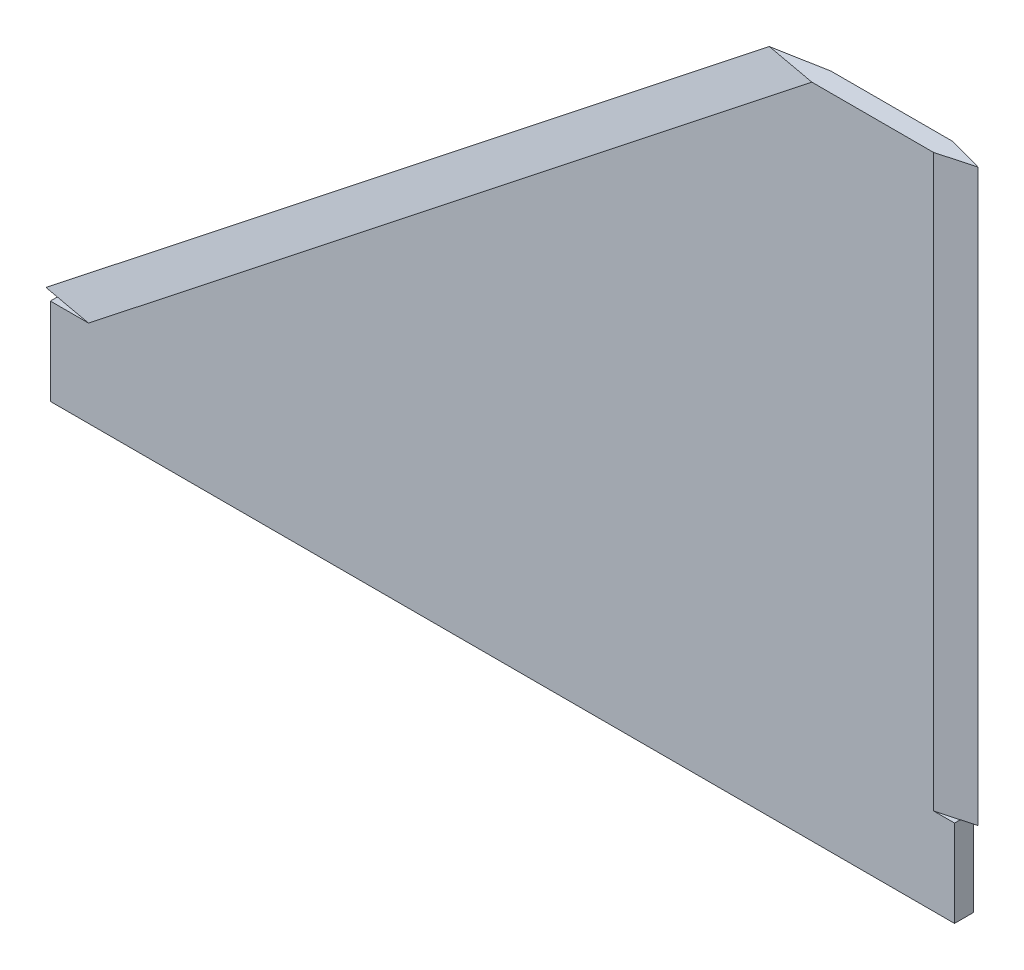
ISO-10303-21;
HEADER;
FILE_DESCRIPTION(('STEP AP214'),'2;1');
FILE_NAME('part.step','',(''),(''),'','','');
FILE_SCHEMA(('AUTOMOTIVE_DESIGN { 1 0 10303 214 1 1 1 1 }'));
ENDSEC;
DATA;
#1=APPLICATION_CONTEXT('core data for automotive mechanical design processes');
#2=APPLICATION_PROTOCOL_DEFINITION('international standard','automotive_design',2000,#1);
#3=PRODUCT_CONTEXT('',#1,'mechanical');
#4=PRODUCT('Part','Part','',(#3));
#5=PRODUCT_RELATED_PRODUCT_CATEGORY('part','',(#4));
#6=PRODUCT_DEFINITION_FORMATION('','',#4);
#7=PRODUCT_DEFINITION_CONTEXT('part definition',#1,'design');
#8=PRODUCT_DEFINITION('design','',#6,#7);
#9=PRODUCT_DEFINITION_SHAPE('','',#8);
#10=(LENGTH_UNIT() NAMED_UNIT(*) SI_UNIT(.MILLI.,.METRE.));
#11=(NAMED_UNIT(*) PLANE_ANGLE_UNIT() SI_UNIT($,.RADIAN.));
#12=(NAMED_UNIT(*) SI_UNIT($,.STERADIAN.) SOLID_ANGLE_UNIT());
#13=UNCERTAINTY_MEASURE_WITH_UNIT(LENGTH_MEASURE(1.E-05),#10,'distance_accuracy_value','');
#14=(GEOMETRIC_REPRESENTATION_CONTEXT(3) GLOBAL_UNCERTAINTY_ASSIGNED_CONTEXT((#13)) GLOBAL_UNIT_ASSIGNED_CONTEXT((#10,
#11,#12)) REPRESENTATION_CONTEXT('',''));
#15=CARTESIAN_POINT('',(0.,0.,0.));
#16=DIRECTION('',(0.,0.,1.));
#17=DIRECTION('',(1.,0.,0.));
#18=AXIS2_PLACEMENT_3D('',#15,#16,#17);
#19=CARTESIAN_POINT('',(1.51730480032105E-13,164.,-2.75));
#20=DIRECTION('',(0.,-1.,0.));
#21=DIRECTION('',(1.,0.,0.));
#22=AXIS2_PLACEMENT_3D('',#19,#20,#21);
#23=PLANE('',#22);
#24=DIRECTION('',(-0.96420539280379,0.,-0.265156483021043));
#25=VECTOR('',#24,1.);
#26=CARTESIAN_POINT('',(9.42126670540406,164.,-34.259151656014));
#27=LINE('',#26,#25);
#28=CARTESIAN_POINT('',(134.,164.,0.));
#29=VERTEX_POINT('',#28);
#30=CARTESIAN_POINT('',(124.,164.,-2.75));
#31=VERTEX_POINT('',#30);
#32=EDGE_CURVE('E133',#29,#31,#27,.T.);
#33=ORIENTED_EDGE('',*,*,#32,.T.);
#34=DIRECTION('',(1.,0.,0.));
#35=VECTOR('',#34,1.);
#36=CARTESIAN_POINT('',(1.51730480032105E-13,164.,-2.75));
#37=LINE('',#36,#35);
#38=CARTESIAN_POINT('',(89.,164.,-2.75));
#39=VERTEX_POINT('',#38);
#40=EDGE_CURVE('E148',#39,#31,#37,.T.);
#41=ORIENTED_EDGE('',*,*,#40,.F.);
#42=DIRECTION('',(-0.983606557377049,0.,0.180327868852459));
#43=VECTOR('',#42,1.);
#44=CARTESIAN_POINT('',(2.40634238108054,164.,13.1255038968019));
#45=LINE('',#44,#43);
#46=CARTESIAN_POINT('',(74.,164.,0.));
#47=VERTEX_POINT('',#46);
#48=EDGE_CURVE('E250',#39,#47,#45,.T.);
#49=ORIENTED_EDGE('',*,*,#48,.T.);
#50=DIRECTION('',(0.983606557377049,0.,0.180327868852459));
#51=VECTOR('',#50,1.);
#52=CARTESIAN_POINT('',(2.40634238108054,164.,-13.1255038968019));
#53=LINE('',#52,#51);
#54=CARTESIAN_POINT('',(89.,164.,2.75));
#55=VERTEX_POINT('',#54);
#56=EDGE_CURVE('E242',#47,#55,#53,.T.);
#57=ORIENTED_EDGE('',*,*,#56,.T.);
#58=DIRECTION('',(1.,0.,0.));
#59=VECTOR('',#58,1.);
#60=CARTESIAN_POINT('',(1.51730480032105E-13,164.,2.75));
#61=LINE('',#60,#59);
#62=CARTESIAN_POINT('',(124.,164.,2.75));
#63=VERTEX_POINT('',#62);
#64=EDGE_CURVE('E202',#55,#63,#61,.T.);
#65=ORIENTED_EDGE('',*,*,#64,.T.);
#66=DIRECTION('',(0.96420539280379,0.,-0.265156483021043));
#67=VECTOR('',#66,1.);
#68=CARTESIAN_POINT('',(9.42126670540407,164.,34.259151656014));
#69=LINE('',#68,#67);
#70=EDGE_CURVE('E150',#63,#29,#69,.T.);
#71=ORIENTED_EDGE('',*,*,#70,.T.);
#72=EDGE_LOOP('',(#33,#41,#49,#57,#65,#71));
#73=FACE_BOUND('',#72,.T.);
#74=ADVANCED_FACE('F41',(#73),#23,.F.);
#75=CARTESIAN_POINT('',(0.,0.,-2.75));
#76=DIRECTION('',(0.,1.,0.));
#77=DIRECTION('',(-1.,0.,0.));
#78=AXIS2_PLACEMENT_3D('',#75,#76,#77);
#79=PLANE('',#78);
#80=DIRECTION('',(0.96420539280379,0.,0.265156483021043));
#81=VECTOR('',#80,1.);
#82=CARTESIAN_POINT('',(9.42126670540393,0.,-34.259151656014));
#83=LINE('',#82,#81);
#84=CARTESIAN_POINT('',(130.,-2.25650632371462E-13,-1.09999999999996));
#85=VERTEX_POINT('',#84);
#86=CARTESIAN_POINT('',(134.,-4.64905891561784E-13,0.));
#87=VERTEX_POINT('',#86);
#88=EDGE_CURVE('E405',#85,#87,#83,.T.);
#89=ORIENTED_EDGE('',*,*,#88,.T.);
#90=DIRECTION('',(-0.96420539280379,0.,0.265156483021043));
#91=VECTOR('',#90,1.);
#92=CARTESIAN_POINT('',(9.42126670540394,0.,34.259151656014));
#93=LINE('',#92,#91);
#94=CARTESIAN_POINT('',(130.,-3.41740524767431E-13,1.09999999999995));
#95=VERTEX_POINT('',#94);
#96=EDGE_CURVE('E412',#87,#95,#93,.T.);
#97=ORIENTED_EDGE('',*,*,#96,.T.);
#98=DIRECTION('',(0.,0.,1.));
#99=VECTOR('',#98,1.);
#100=CARTESIAN_POINT('',(130.,-2.32452945780892E-13,-2.75));
#101=LINE('',#100,#99);
#102=EDGE_CURVE('E57',#85,#95,#101,.T.);
#103=ORIENTED_EDGE('',*,*,#102,.F.);
#104=EDGE_LOOP('',(#89,#97,#103));
#105=FACE_BOUND('',#104,.T.);
#106=ADVANCED_FACE('F271',(#105),#79,.F.);
#107=CARTESIAN_POINT('',(0.,0.,-2.75));
#108=DIRECTION('',(0.,0.,1.));
#109=DIRECTION('',(1.,0.,0.));
#110=AXIS2_PLACEMENT_3D('',#107,#108,#109);
#111=PLANE('',#110);
#112=DIRECTION('',(0.,1.,0.));
#113=VECTOR('',#112,1.);
#114=CARTESIAN_POINT('',(124.,-10.3712342563461,-2.75));
#115=LINE('',#114,#113);
#116=CARTESIAN_POINT('',(124.,-4.30211422042247E-13,-2.75));
#117=VERTEX_POINT('',#116);
#118=EDGE_CURVE('E130',#117,#31,#115,.T.);
#119=ORIENTED_EDGE('',*,*,#118,.F.);
#120=DIRECTION('',(1.,0.,0.));
#121=VECTOR('',#120,1.);
#122=CARTESIAN_POINT('',(0.,0.,-2.75));
#123=LINE('',#122,#121);
#124=CARTESIAN_POINT('',(130.,-4.51028103753969E-13,-2.75));
#125=VERTEX_POINT('',#124);
#126=EDGE_CURVE('E142',#117,#125,#123,.T.);
#127=ORIENTED_EDGE('',*,*,#126,.T.);
#128=DIRECTION('',(0.,1.,0.));
#129=VECTOR('',#128,1.);
#130=CARTESIAN_POINT('',(130.,0.,-2.75));
#131=LINE('',#130,#129);
#132=CARTESIAN_POINT('',(130.,-25.,-2.75));
#133=VERTEX_POINT('',#132);
#134=EDGE_CURVE('E160',#133,#125,#131,.T.);
#135=ORIENTED_EDGE('',*,*,#134,.F.);
#136=DIRECTION('',(1.,0.,0.));
#137=VECTOR('',#136,1.);
#138=CARTESIAN_POINT('',(0.,-25.,-2.75));
#139=LINE('',#138,#137);
#140=CARTESIAN_POINT('',(-130.,-25.,-2.75));
#141=VERTEX_POINT('',#140);
#142=EDGE_CURVE('E165',#141,#133,#139,.T.);
#143=ORIENTED_EDGE('',*,*,#142,.F.);
#144=DIRECTION('',(0.,1.,0.));
#145=VECTOR('',#144,1.);
#146=CARTESIAN_POINT('',(-130.,0.,-2.75));
#147=LINE('',#146,#145);
#148=CARTESIAN_POINT('',(-130.,4.50478511801368E-13,-2.75));
#149=VERTEX_POINT('',#148);
#150=EDGE_CURVE('E159',#141,#149,#147,.T.);
#151=ORIENTED_EDGE('',*,*,#150,.T.);
#152=DIRECTION('',(-1.,0.,0.));
#153=VECTOR('',#152,1.);
#154=CARTESIAN_POINT('',(0.,0.,-2.75));
#155=LINE('',#154,#153);
#156=CARTESIAN_POINT('',(-119.,4.13456753044168E-13,-2.75));
#157=VERTEX_POINT('',#156);
#158=EDGE_CURVE('E11',#157,#149,#155,.T.);
#159=ORIENTED_EDGE('',*,*,#158,.F.);
#160=DIRECTION('',(0.785269165627779,0.619154534437286,0.));
#161=VECTOR('',#160,1.);
#162=CARTESIAN_POINT('',(-134.658409095229,-12.3460533250838,-2.75));
#163=LINE('',#162,#161);
#164=EDGE_CURVE('E157',#157,#39,#163,.T.);
#165=ORIENTED_EDGE('',*,*,#164,.T.);
#166=ORIENTED_EDGE('',*,*,#40,.T.);
#167=EDGE_LOOP('',(#119,#127,#135,#143,#151,#159,#165,#166));
#168=FACE_BOUND('',#167,.T.);
#169=ADVANCED_FACE('F154',(#168),#111,.F.);
#170=CARTESIAN_POINT('',(0.,0.,2.75));
#171=DIRECTION('',(0.,0.,1.));
#172=DIRECTION('',(1.,0.,0.));
#173=AXIS2_PLACEMENT_3D('',#170,#171,#172);
#174=PLANE('',#173);
#175=DIRECTION('',(-1.,0.,0.));
#176=VECTOR('',#175,1.);
#177=CARTESIAN_POINT('',(0.,0.,2.75));
#178=LINE('',#177,#176);
#179=CARTESIAN_POINT('',(130.,-4.51028103753969E-13,2.75));
#180=VERTEX_POINT('',#179);
#181=CARTESIAN_POINT('',(124.,-4.30211422042247E-13,2.75));
#182=VERTEX_POINT('',#181);
#183=EDGE_CURVE('E198',#180,#182,#178,.T.);
#184=ORIENTED_EDGE('',*,*,#183,.T.);
#185=DIRECTION('',(0.,1.,0.));
#186=VECTOR('',#185,1.);
#187=CARTESIAN_POINT('',(124.,-10.3712342563461,2.75));
#188=LINE('',#187,#186);
#189=EDGE_CURVE('E418',#182,#63,#188,.T.);
#190=ORIENTED_EDGE('',*,*,#189,.T.);
#191=ORIENTED_EDGE('',*,*,#64,.F.);
#192=DIRECTION('',(0.785269165627779,0.619154534437286,0.));
#193=VECTOR('',#192,1.);
#194=CARTESIAN_POINT('',(-134.658409095229,-12.3460533250838,2.75));
#195=LINE('',#194,#193);
#196=CARTESIAN_POINT('',(-119.,4.13456753044168E-13,2.75));
#197=VERTEX_POINT('',#196);
#198=EDGE_CURVE('E226',#197,#55,#195,.T.);
#199=ORIENTED_EDGE('',*,*,#198,.F.);
#200=DIRECTION('',(-1.,0.,0.));
#201=VECTOR('',#200,1.);
#202=CARTESIAN_POINT('',(-223.658409095229,7.75421393761633E-13,2.75));
#203=LINE('',#202,#201);
#204=CARTESIAN_POINT('',(-130.,4.51028103753969E-13,2.75));
#205=VERTEX_POINT('',#204);
#206=EDGE_CURVE('E224',#197,#205,#203,.T.);
#207=ORIENTED_EDGE('',*,*,#206,.T.);
#208=DIRECTION('',(0.,1.,0.));
#209=VECTOR('',#208,1.);
#210=CARTESIAN_POINT('',(-130.,0.,2.75));
#211=LINE('',#210,#209);
#212=CARTESIAN_POINT('',(-130.,-25.,2.75));
#213=VERTEX_POINT('',#212);
#214=EDGE_CURVE('E207',#213,#205,#211,.T.);
#215=ORIENTED_EDGE('',*,*,#214,.F.);
#216=DIRECTION('',(1.,0.,0.));
#217=VECTOR('',#216,1.);
#218=CARTESIAN_POINT('',(0.,-25.,2.75));
#219=LINE('',#218,#217);
#220=CARTESIAN_POINT('',(130.,-25.,2.75));
#221=VERTEX_POINT('',#220);
#222=EDGE_CURVE('E167',#213,#221,#219,.T.);
#223=ORIENTED_EDGE('',*,*,#222,.T.);
#224=DIRECTION('',(0.,1.,0.));
#225=VECTOR('',#224,1.);
#226=CARTESIAN_POINT('',(130.,0.,2.75));
#227=LINE('',#226,#225);
#228=EDGE_CURVE('E190',#221,#180,#227,.T.);
#229=ORIENTED_EDGE('',*,*,#228,.T.);
#230=EDGE_LOOP('',(#184,#190,#191,#199,#207,#215,#223,#229));
#231=FACE_BOUND('',#230,.T.);
#232=ADVANCED_FACE('F196',(#231),#174,.T.);
#233=DIRECTION('',(0.983606557377049,0.,-0.18032786885246));
#234=VECTOR('',#233,1.);
#235=CARTESIAN_POINT('',(-220.742884370552,7.66747776381749E-13,15.9028621346012));
#236=LINE('',#235,#234);
#237=CARTESIAN_POINT('',(-134.,4.63171168085807E-13,0.));
#238=VERTEX_POINT('',#237);
#239=CARTESIAN_POINT('',(-130.,2.2596007639543E-13,-0.733333333333336));
#240=VERTEX_POINT('',#239);
#241=EDGE_CURVE('E245',#238,#240,#236,.T.);
#242=ORIENTED_EDGE('',*,*,#241,.T.);
#243=DIRECTION('',(0.,0.,1.));
#244=VECTOR('',#243,1.);
#245=CARTESIAN_POINT('',(-130.,4.51028103753969E-13,-2.75));
#246=LINE('',#245,#244);
#247=CARTESIAN_POINT('',(-130.,4.51920152790859E-13,0.733333333333336));
#248=VERTEX_POINT('',#247);
#249=EDGE_CURVE('E182',#240,#248,#246,.T.);
#250=ORIENTED_EDGE('',*,*,#249,.T.);
#251=DIRECTION('',(-0.983606557377049,0.,-0.18032786885246));
#252=VECTOR('',#251,1.);
#253=CARTESIAN_POINT('',(-220.742884370552,7.66747776381749E-13,-15.9028621346012));
#254=LINE('',#253,#252);
#255=EDGE_CURVE('E230',#248,#238,#254,.T.);
#256=ORIENTED_EDGE('',*,*,#255,.T.);
#257=EDGE_LOOP('',(#242,#250,#256));
#258=FACE_BOUND('',#257,.T.);
#259=ADVANCED_FACE('F277',(#258),#79,.F.);
#260=CARTESIAN_POINT('',(130.,0.,-2.75));
#261=DIRECTION('',(1.,0.,0.));
#262=DIRECTION('',(0.,0.,-1.));
#263=AXIS2_PLACEMENT_3D('',#260,#261,#262);
#264=PLANE('',#263);
#265=EDGE_CURVE('E183',#125,#85,#101,.T.);
#266=ORIENTED_EDGE('',*,*,#265,.T.);
#267=ORIENTED_EDGE('',*,*,#102,.T.);
#268=EDGE_CURVE('E174',#95,#180,#101,.T.);
#269=ORIENTED_EDGE('',*,*,#268,.T.);
#270=ORIENTED_EDGE('',*,*,#228,.F.);
#271=DIRECTION('',(0.,0.,1.));
#272=VECTOR('',#271,1.);
#273=CARTESIAN_POINT('',(130.,-25.,-2.75));
#274=LINE('',#273,#272);
#275=EDGE_CURVE('E50',#133,#221,#274,.T.);
#276=ORIENTED_EDGE('',*,*,#275,.F.);
#277=ORIENTED_EDGE('',*,*,#134,.T.);
#278=EDGE_LOOP('',(#266,#267,#269,#270,#276,#277));
#279=FACE_BOUND('',#278,.T.);
#280=ADVANCED_FACE('F43',(#279),#264,.T.);
#281=CARTESIAN_POINT('',(0.,-25.,-2.75));
#282=DIRECTION('',(0.,-1.,0.));
#283=DIRECTION('',(0.,0.,-1.));
#284=AXIS2_PLACEMENT_3D('',#281,#282,#283);
#285=PLANE('',#284);
#286=ORIENTED_EDGE('',*,*,#275,.T.);
#287=ORIENTED_EDGE('',*,*,#222,.F.);
#288=DIRECTION('',(0.,0.,1.));
#289=VECTOR('',#288,1.);
#290=CARTESIAN_POINT('',(-130.,-25.,-2.75));
#291=LINE('',#290,#289);
#292=EDGE_CURVE('E177',#141,#213,#291,.T.);
#293=ORIENTED_EDGE('',*,*,#292,.F.);
#294=ORIENTED_EDGE('',*,*,#142,.T.);
#295=EDGE_LOOP('',(#286,#287,#293,#294));
#296=FACE_BOUND('',#295,.T.);
#297=ADVANCED_FACE('F267',(#296),#285,.T.);
#298=CARTESIAN_POINT('',(-130.,0.,-2.75));
#299=DIRECTION('',(1.,0.,0.));
#300=DIRECTION('',(0.,0.,-1.));
#301=AXIS2_PLACEMENT_3D('',#298,#299,#300);
#302=PLANE('',#301);
#303=ORIENTED_EDGE('',*,*,#292,.T.);
#304=ORIENTED_EDGE('',*,*,#214,.T.);
#305=DIRECTION('',(0.,0.,1.));
#306=VECTOR('',#305,1.);
#307=CARTESIAN_POINT('',(-130.,0.,-2.75));
#308=LINE('',#307,#306);
#309=EDGE_CURVE('E203',#248,#205,#308,.T.);
#310=ORIENTED_EDGE('',*,*,#309,.F.);
#311=ORIENTED_EDGE('',*,*,#249,.F.);
#312=EDGE_CURVE('E180',#149,#240,#246,.T.);
#313=ORIENTED_EDGE('',*,*,#312,.F.);
#314=ORIENTED_EDGE('',*,*,#150,.F.);
#315=EDGE_LOOP('',(#303,#304,#310,#311,#313,#314));
#316=FACE_BOUND('',#315,.T.);
#317=ADVANCED_FACE('F218',(#316),#302,.F.);
#318=CARTESIAN_POINT('',(0.,0.,-2.75));
#319=DIRECTION('',(0.,1.,0.));
#320=DIRECTION('',(-1.,0.,0.));
#321=AXIS2_PLACEMENT_3D('',#318,#319,#320);
#322=PLANE('',#321);
#323=ORIENTED_EDGE('',*,*,#309,.T.);
#324=ORIENTED_EDGE('',*,*,#206,.F.);
#325=EDGE_CURVE('E209',#197,#248,#254,.T.);
#326=ORIENTED_EDGE('',*,*,#325,.T.);
#327=EDGE_LOOP('',(#323,#324,#326));
#328=FACE_BOUND('',#327,.T.);
#329=ADVANCED_FACE('F258',(#328),#322,.T.);
#330=CARTESIAN_POINT('',(-221.252066714148,-12.3460533250837,-13.1255038968019));
#331=DIRECTION('',(-0.175788920678838,0.222951801836576,0.95884865824821));
#332=DIRECTION('',(0.,-0.97401615245708,0.226478552522541));
#333=AXIS2_PLACEMENT_3D('',#330,#331,#332);
#334=PLANE('',#333);
#335=ORIENTED_EDGE('',*,*,#198,.T.);
#336=ORIENTED_EDGE('',*,*,#56,.F.);
#337=DIRECTION('',(0.785269165627779,0.619154534437286,0.));
#338=VECTOR('',#337,1.);
#339=CARTESIAN_POINT('',(-149.658409095229,-12.3460533250838,0.));
#340=LINE('',#339,#338);
#341=EDGE_CURVE('E236',#238,#47,#340,.T.);
#342=ORIENTED_EDGE('',*,*,#341,.F.);
#343=ORIENTED_EDGE('',*,*,#255,.F.);
#344=ORIENTED_EDGE('',*,*,#325,.F.);
#345=EDGE_LOOP('',(#335,#336,#342,#343,#344));
#346=FACE_BOUND('',#345,.T.);
#347=ADVANCED_FACE('F257',(#346),#334,.T.);
#348=CARTESIAN_POINT('',(0.,0.,-2.75));
#349=DIRECTION('',(0.,1.,0.));
#350=DIRECTION('',(-1.,0.,0.));
#351=AXIS2_PLACEMENT_3D('',#348,#349,#350);
#352=PLANE('',#351);
#353=ORIENTED_EDGE('',*,*,#312,.T.);
#354=EDGE_CURVE('E427',#240,#157,#236,.T.);
#355=ORIENTED_EDGE('',*,*,#354,.T.);
#356=ORIENTED_EDGE('',*,*,#158,.T.);
#357=EDGE_LOOP('',(#353,#355,#356));
#358=FACE_BOUND('',#357,.T.);
#359=ADVANCED_FACE('F265',(#358),#352,.T.);
#360=CARTESIAN_POINT('',(-221.252066714148,-12.3460533250837,13.1255038968019));
#361=DIRECTION('',(-0.175788920678838,0.222951801836576,-0.95884865824821));
#362=DIRECTION('',(0.,0.97401615245708,0.226478552522541));
#363=AXIS2_PLACEMENT_3D('',#360,#361,#362);
#364=PLANE('',#363);
#365=ORIENTED_EDGE('',*,*,#341,.T.);
#366=ORIENTED_EDGE('',*,*,#48,.F.);
#367=ORIENTED_EDGE('',*,*,#164,.F.);
#368=ORIENTED_EDGE('',*,*,#354,.F.);
#369=ORIENTED_EDGE('',*,*,#241,.F.);
#370=EDGE_LOOP('',(#365,#366,#367,#368,#369));
#371=FACE_BOUND('',#370,.T.);
#372=ADVANCED_FACE('F249',(#371),#364,.T.);
#373=CARTESIAN_POINT('',(9.42126670540391,-10.371234256346,34.259151656014));
#374=DIRECTION('',(0.265156483021043,0.,0.96420539280379));
#375=DIRECTION('',(0.96420539280379,0.,-0.265156483021043));
#376=AXIS2_PLACEMENT_3D('',#373,#374,#375);
#377=PLANE('',#376);
#378=DIRECTION('',(0.,1.,0.));
#379=VECTOR('',#378,1.);
#380=CARTESIAN_POINT('',(134.,-10.3712342563462,0.));
#381=LINE('',#380,#379);
#382=EDGE_CURVE('E419',#87,#29,#381,.T.);
#383=ORIENTED_EDGE('',*,*,#382,.T.);
#384=ORIENTED_EDGE('',*,*,#70,.F.);
#385=ORIENTED_EDGE('',*,*,#189,.F.);
#386=EDGE_CURVE('E415',#95,#182,#93,.T.);
#387=ORIENTED_EDGE('',*,*,#386,.F.);
#388=ORIENTED_EDGE('',*,*,#96,.F.);
#389=EDGE_LOOP('',(#383,#384,#385,#387,#388));
#390=FACE_BOUND('',#389,.T.);
#391=ADVANCED_FACE('F337',(#390),#377,.T.);
#392=CARTESIAN_POINT('',(0.,0.,-2.75));
#393=DIRECTION('',(0.,1.,0.));
#394=DIRECTION('',(-1.,0.,0.));
#395=AXIS2_PLACEMENT_3D('',#392,#393,#394);
#396=PLANE('',#395);
#397=ORIENTED_EDGE('',*,*,#386,.T.);
#398=ORIENTED_EDGE('',*,*,#183,.F.);
#399=ORIENTED_EDGE('',*,*,#268,.F.);
#400=EDGE_LOOP('',(#397,#398,#399));
#401=FACE_BOUND('',#400,.T.);
#402=ADVANCED_FACE('F374',(#401),#396,.T.);
#403=CARTESIAN_POINT('',(9.4212667054039,-10.371234256346,-34.259151656014));
#404=DIRECTION('',(0.265156483021043,0.,-0.96420539280379));
#405=DIRECTION('',(-0.96420539280379,0.,-0.265156483021043));
#406=AXIS2_PLACEMENT_3D('',#403,#404,#405);
#407=PLANE('',#406);
#408=ORIENTED_EDGE('',*,*,#118,.T.);
#409=ORIENTED_EDGE('',*,*,#32,.F.);
#410=ORIENTED_EDGE('',*,*,#382,.F.);
#411=ORIENTED_EDGE('',*,*,#88,.F.);
#412=EDGE_CURVE('E136',#117,#85,#83,.T.);
#413=ORIENTED_EDGE('',*,*,#412,.F.);
#414=EDGE_LOOP('',(#408,#409,#410,#411,#413));
#415=FACE_BOUND('',#414,.T.);
#416=ADVANCED_FACE('F132',(#415),#407,.T.);
#417=CARTESIAN_POINT('',(0.,0.,-2.75));
#418=DIRECTION('',(0.,1.,0.));
#419=DIRECTION('',(-1.,0.,0.));
#420=AXIS2_PLACEMENT_3D('',#417,#418,#419);
#421=PLANE('',#420);
#422=ORIENTED_EDGE('',*,*,#126,.F.);
#423=ORIENTED_EDGE('',*,*,#412,.T.);
#424=ORIENTED_EDGE('',*,*,#265,.F.);
#425=EDGE_LOOP('',(#422,#423,#424));
#426=FACE_BOUND('',#425,.T.);
#427=ADVANCED_FACE('F390',(#426),#421,.T.);
#428=CLOSED_SHELL('',(#74,#106,#169,#232,#259,#280,#297,#317,#329,#347,#359,#372,#391,#402,#416,#427));
#429=MANIFOLD_SOLID_BREP('B2',#428);
#430=ADVANCED_BREP_SHAPE_REPRESENTATION('',(#18,#429),#14);
#431=SHAPE_DEFINITION_REPRESENTATION(#9,#430);
ENDSEC;
END-ISO-10303-21;
